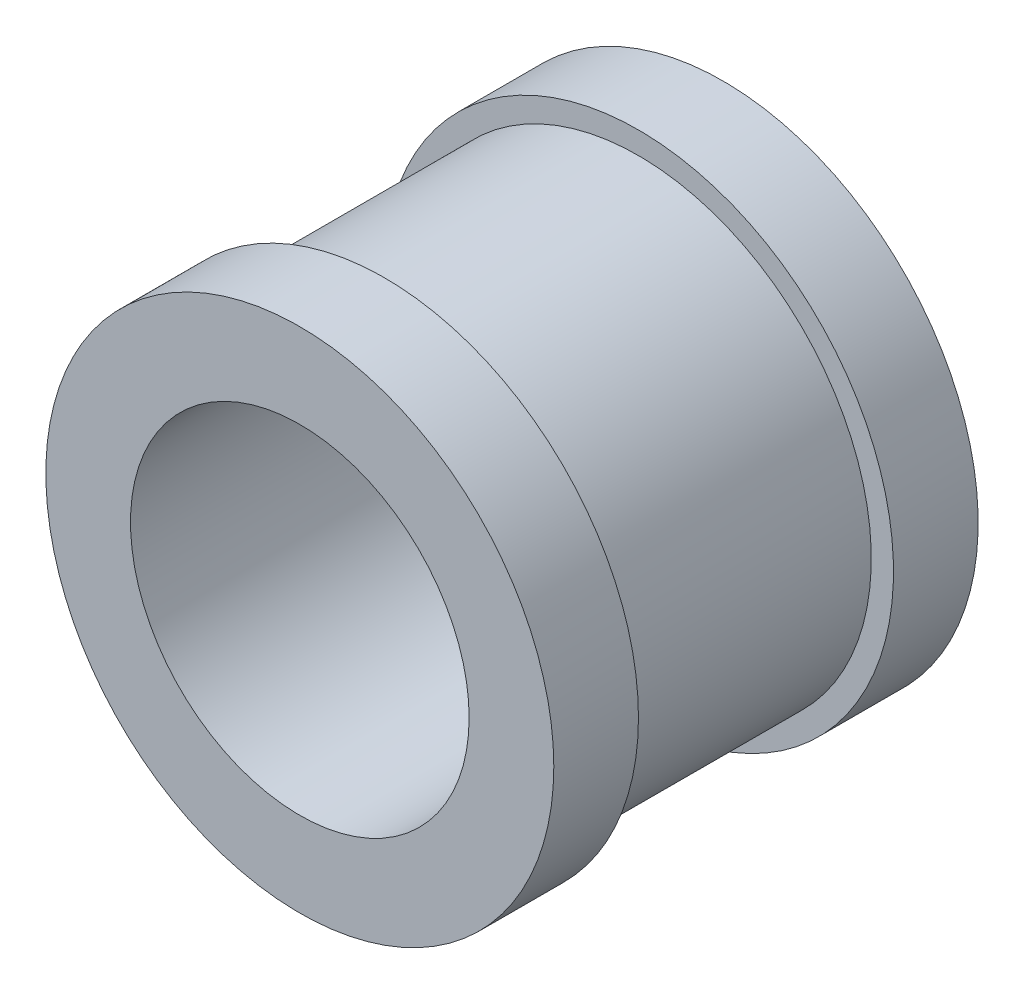
ISO-10303-21;
HEADER;
FILE_DESCRIPTION(('STEP AP214'),'2;1');
FILE_NAME('part.step','',(''),(''),'','','');
FILE_SCHEMA(('AUTOMOTIVE_DESIGN { 1 0 10303 214 1 1 1 1 }'));
ENDSEC;
DATA;
#1=APPLICATION_CONTEXT('core data for automotive mechanical design processes');
#2=APPLICATION_PROTOCOL_DEFINITION('international standard','automotive_design',2000,#1);
#3=PRODUCT_CONTEXT('',#1,'mechanical');
#4=PRODUCT('Part','Part','',(#3));
#5=PRODUCT_RELATED_PRODUCT_CATEGORY('part','',(#4));
#6=PRODUCT_DEFINITION_FORMATION('','',#4);
#7=PRODUCT_DEFINITION_CONTEXT('part definition',#1,'design');
#8=PRODUCT_DEFINITION('design','',#6,#7);
#9=PRODUCT_DEFINITION_SHAPE('','',#8);
#10=(LENGTH_UNIT() NAMED_UNIT(*) SI_UNIT(.MILLI.,.METRE.));
#11=(NAMED_UNIT(*) PLANE_ANGLE_UNIT() SI_UNIT($,.RADIAN.));
#12=(NAMED_UNIT(*) SI_UNIT($,.STERADIAN.) SOLID_ANGLE_UNIT());
#13=UNCERTAINTY_MEASURE_WITH_UNIT(LENGTH_MEASURE(1.E-05),#10,'distance_accuracy_value','');
#14=(GEOMETRIC_REPRESENTATION_CONTEXT(3) GLOBAL_UNCERTAINTY_ASSIGNED_CONTEXT((#13)) GLOBAL_UNIT_ASSIGNED_CONTEXT((#10,
#11,#12)) REPRESENTATION_CONTEXT('',''));
#15=CARTESIAN_POINT('',(0.,0.,0.));
#16=DIRECTION('',(0.,0.,1.));
#17=DIRECTION('',(1.,0.,0.));
#18=AXIS2_PLACEMENT_3D('',#15,#16,#17);
#19=CARTESIAN_POINT('',(0.,0.,5.));
#20=DIRECTION('',(0.,0.,-1.));
#21=DIRECTION('',(-1.,0.,0.));
#22=AXIS2_PLACEMENT_3D('',#19,#20,#21);
#23=CYLINDRICAL_SURFACE('',#22,2.75);
#24=CARTESIAN_POINT('',(0.,0.,4.));
#25=DIRECTION('',(0.,0.,1.));
#26=DIRECTION('',(1.,0.,0.));
#27=AXIS2_PLACEMENT_3D('',#24,#25,#26);
#28=CIRCLE('',#27,2.75);
#29=CARTESIAN_POINT('',(2.75,0.,4.));
#30=VERTEX_POINT('',#29);
#31=EDGE_CURVE('E47',#30,#30,#28,.T.);
#32=ORIENTED_EDGE('',*,*,#31,.F.);
#33=EDGE_LOOP('',(#32));
#34=FACE_BOUND('',#33,.T.);
#35=CARTESIAN_POINT('',(0.,0.,1.));
#36=DIRECTION('',(0.,0.,-1.));
#37=DIRECTION('',(-1.,0.,0.));
#38=AXIS2_PLACEMENT_3D('',#35,#36,#37);
#39=CIRCLE('',#38,2.75);
#40=CARTESIAN_POINT('',(-2.75,0.,1.));
#41=VERTEX_POINT('',#40);
#42=EDGE_CURVE('E10',#41,#41,#39,.T.);
#43=ORIENTED_EDGE('',*,*,#42,.F.);
#44=EDGE_LOOP('',(#43));
#45=FACE_BOUND('',#44,.T.);
#46=ADVANCED_FACE('F39',(#34,#45),#23,.T.);
#47=CARTESIAN_POINT('',(0.,0.,5.));
#48=DIRECTION('',(0.,0.,1.));
#49=DIRECTION('',(1.,0.,0.));
#50=AXIS2_PLACEMENT_3D('',#47,#48,#49);
#51=PLANE('',#50);
#52=CARTESIAN_POINT('',(0.,0.,5.));
#53=DIRECTION('',(0.,0.,1.));
#54=DIRECTION('',(1.,0.,0.));
#55=AXIS2_PLACEMENT_3D('',#52,#53,#54);
#56=CIRCLE('',#55,2.);
#57=CARTESIAN_POINT('',(2.,0.,5.));
#58=VERTEX_POINT('',#57);
#59=EDGE_CURVE('E53',#58,#58,#56,.T.);
#60=ORIENTED_EDGE('',*,*,#59,.F.);
#61=EDGE_LOOP('',(#60));
#62=FACE_BOUND('',#61,.T.);
#63=CARTESIAN_POINT('',(0.,0.,5.));
#64=DIRECTION('',(0.,0.,1.));
#65=DIRECTION('',(1.,0.,0.));
#66=AXIS2_PLACEMENT_3D('',#63,#64,#65);
#67=CIRCLE('',#66,3.);
#68=CARTESIAN_POINT('',(3.,0.,5.));
#69=VERTEX_POINT('',#68);
#70=EDGE_CURVE('E63',#69,#69,#67,.T.);
#71=ORIENTED_EDGE('',*,*,#70,.T.);
#72=EDGE_LOOP('',(#71));
#73=FACE_BOUND('',#72,.T.);
#74=ADVANCED_FACE('F89',(#62,#73),#51,.T.);
#75=CARTESIAN_POINT('',(0.,0.,0.));
#76=DIRECTION('',(0.,0.,1.));
#77=DIRECTION('',(1.,0.,0.));
#78=AXIS2_PLACEMENT_3D('',#75,#76,#77);
#79=PLANE('',#78);
#80=CARTESIAN_POINT('',(0.,0.,0.));
#81=DIRECTION('',(0.,0.,1.));
#82=DIRECTION('',(1.,0.,0.));
#83=AXIS2_PLACEMENT_3D('',#80,#81,#82);
#84=CIRCLE('',#83,2.);
#85=CARTESIAN_POINT('',(2.,0.,0.));
#86=VERTEX_POINT('',#85);
#87=EDGE_CURVE('E42',#86,#86,#84,.T.);
#88=ORIENTED_EDGE('',*,*,#87,.T.);
#89=EDGE_LOOP('',(#88));
#90=FACE_BOUND('',#89,.T.);
#91=CARTESIAN_POINT('',(0.,0.,0.));
#92=DIRECTION('',(0.,0.,-1.));
#93=DIRECTION('',(-1.,0.,0.));
#94=AXIS2_PLACEMENT_3D('',#91,#92,#93);
#95=CIRCLE('',#94,3.01241638226215);
#96=CARTESIAN_POINT('',(-3.01241638226215,0.,0.));
#97=VERTEX_POINT('',#96);
#98=EDGE_CURVE('E57',#97,#97,#95,.T.);
#99=ORIENTED_EDGE('',*,*,#98,.T.);
#100=EDGE_LOOP('',(#99));
#101=FACE_BOUND('',#100,.T.);
#102=ADVANCED_FACE('F75',(#90,#101),#79,.F.);
#103=CARTESIAN_POINT('',(0.,0.,5.));
#104=DIRECTION('',(0.,0.,-1.));
#105=DIRECTION('',(-1.,0.,0.));
#106=AXIS2_PLACEMENT_3D('',#103,#104,#105);
#107=CYLINDRICAL_SURFACE('',#106,2.);
#108=ORIENTED_EDGE('',*,*,#87,.F.);
#109=EDGE_LOOP('',(#108));
#110=FACE_BOUND('',#109,.T.);
#111=ORIENTED_EDGE('',*,*,#59,.T.);
#112=EDGE_LOOP('',(#111));
#113=FACE_BOUND('',#112,.T.);
#114=ADVANCED_FACE('F78',(#110,#113),#107,.F.);
#115=CARTESIAN_POINT('',(0.,0.,4.));
#116=DIRECTION('',(0.,0.,1.));
#117=DIRECTION('',(1.,0.,0.));
#118=AXIS2_PLACEMENT_3D('',#115,#116,#117);
#119=PLANE('',#118);
#120=CARTESIAN_POINT('',(0.,0.,4.));
#121=DIRECTION('',(0.,0.,1.));
#122=DIRECTION('',(1.,0.,0.));
#123=AXIS2_PLACEMENT_3D('',#120,#121,#122);
#124=CIRCLE('',#123,3.);
#125=CARTESIAN_POINT('',(3.,0.,4.));
#126=VERTEX_POINT('',#125);
#127=EDGE_CURVE('E59',#126,#126,#124,.T.);
#128=ORIENTED_EDGE('',*,*,#127,.F.);
#129=EDGE_LOOP('',(#128));
#130=FACE_BOUND('',#129,.T.);
#131=ORIENTED_EDGE('',*,*,#31,.T.);
#132=EDGE_LOOP('',(#131));
#133=FACE_BOUND('',#132,.T.);
#134=ADVANCED_FACE('F80',(#130,#133),#119,.F.);
#135=CARTESIAN_POINT('',(0.,0.,4.));
#136=DIRECTION('',(0.,0.,1.));
#137=DIRECTION('',(1.,0.,0.));
#138=AXIS2_PLACEMENT_3D('',#135,#136,#137);
#139=CYLINDRICAL_SURFACE('',#138,3.);
#140=ORIENTED_EDGE('',*,*,#127,.T.);
#141=EDGE_LOOP('',(#140));
#142=FACE_BOUND('',#141,.T.);
#143=ORIENTED_EDGE('',*,*,#70,.F.);
#144=EDGE_LOOP('',(#143));
#145=FACE_BOUND('',#144,.T.);
#146=ADVANCED_FACE('F86',(#142,#145),#139,.T.);
#147=CARTESIAN_POINT('',(0.,0.,1.));
#148=DIRECTION('',(0.,0.,-1.));
#149=DIRECTION('',(-1.,0.,0.));
#150=AXIS2_PLACEMENT_3D('',#147,#148,#149);
#151=PLANE('',#150);
#152=CARTESIAN_POINT('',(0.,0.,1.));
#153=DIRECTION('',(0.,0.,-1.));
#154=DIRECTION('',(-1.,0.,0.));
#155=AXIS2_PLACEMENT_3D('',#152,#153,#154);
#156=CIRCLE('',#155,3.01241638226215);
#157=CARTESIAN_POINT('',(-3.01241638226215,0.,1.));
#158=VERTEX_POINT('',#157);
#159=EDGE_CURVE('E66',#158,#158,#156,.T.);
#160=ORIENTED_EDGE('',*,*,#159,.F.);
#161=EDGE_LOOP('',(#160));
#162=FACE_BOUND('',#161,.T.);
#163=ORIENTED_EDGE('',*,*,#42,.T.);
#164=EDGE_LOOP('',(#163));
#165=FACE_BOUND('',#164,.T.);
#166=ADVANCED_FACE('F107',(#162,#165),#151,.F.);
#167=CARTESIAN_POINT('',(0.,0.,1.));
#168=DIRECTION('',(0.,0.,-1.));
#169=DIRECTION('',(-1.,0.,0.));
#170=AXIS2_PLACEMENT_3D('',#167,#168,#169);
#171=CYLINDRICAL_SURFACE('',#170,3.01241638226215);
#172=ORIENTED_EDGE('',*,*,#159,.T.);
#173=EDGE_LOOP('',(#172));
#174=FACE_BOUND('',#173,.T.);
#175=ORIENTED_EDGE('',*,*,#98,.F.);
#176=EDGE_LOOP('',(#175));
#177=FACE_BOUND('',#176,.T.);
#178=ADVANCED_FACE('F112',(#174,#177),#171,.T.);
#179=CLOSED_SHELL('',(#46,#74,#102,#114,#134,#146,#166,#178));
#180=MANIFOLD_SOLID_BREP('B2',#179);
#181=ADVANCED_BREP_SHAPE_REPRESENTATION('',(#18,#180),#14);
#182=SHAPE_DEFINITION_REPRESENTATION(#9,#181);
ENDSEC;
END-ISO-10303-21;
